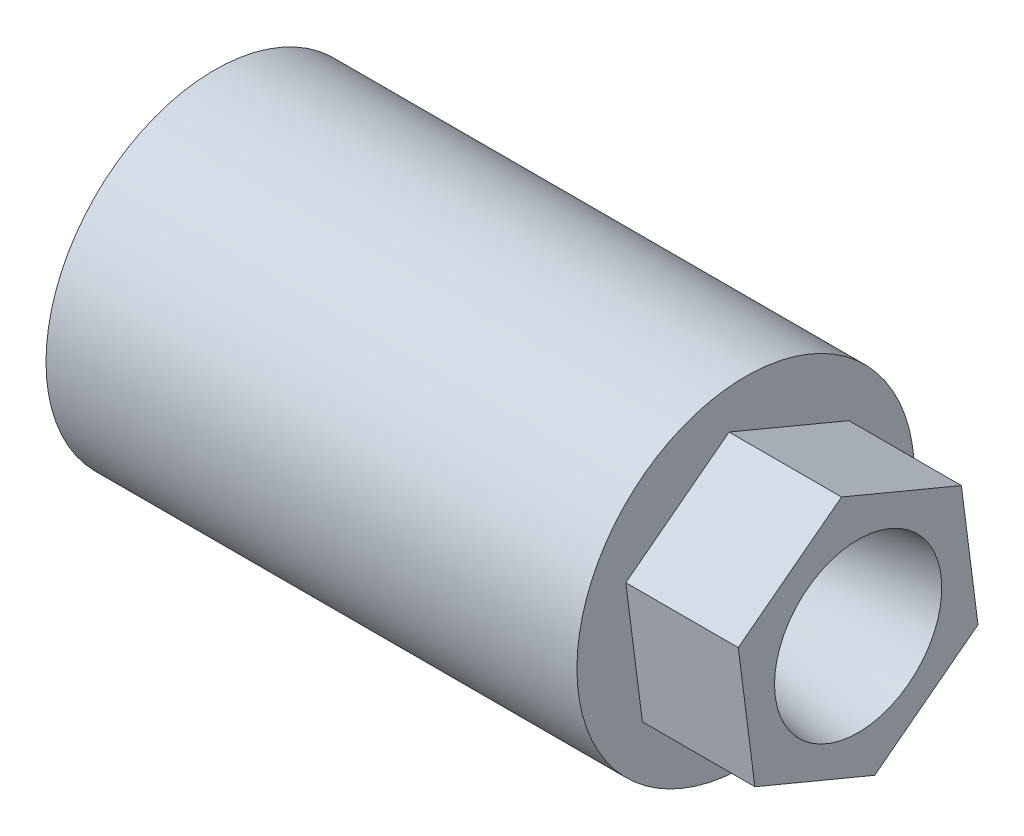
ISO-10303-21;
HEADER;
FILE_DESCRIPTION(('STEP AP214'),'2;1');
FILE_NAME('part.step','',(''),(''),'','','');
FILE_SCHEMA(('AUTOMOTIVE_DESIGN { 1 0 10303 214 1 1 1 1 }'));
ENDSEC;
DATA;
#1=APPLICATION_CONTEXT('core data for automotive mechanical design processes');
#2=APPLICATION_PROTOCOL_DEFINITION('international standard','automotive_design',2000,#1);
#3=PRODUCT_CONTEXT('',#1,'mechanical');
#4=PRODUCT('Part','Part','',(#3));
#5=PRODUCT_RELATED_PRODUCT_CATEGORY('part','',(#4));
#6=PRODUCT_DEFINITION_FORMATION('','',#4);
#7=PRODUCT_DEFINITION_CONTEXT('part definition',#1,'design');
#8=PRODUCT_DEFINITION('design','',#6,#7);
#9=PRODUCT_DEFINITION_SHAPE('','',#8);
#10=(LENGTH_UNIT() NAMED_UNIT(*) SI_UNIT(.MILLI.,.METRE.));
#11=(NAMED_UNIT(*) PLANE_ANGLE_UNIT() SI_UNIT($,.RADIAN.));
#12=(NAMED_UNIT(*) SI_UNIT($,.STERADIAN.) SOLID_ANGLE_UNIT());
#13=UNCERTAINTY_MEASURE_WITH_UNIT(LENGTH_MEASURE(1.E-05),#10,'distance_accuracy_value','');
#14=(GEOMETRIC_REPRESENTATION_CONTEXT(3) GLOBAL_UNCERTAINTY_ASSIGNED_CONTEXT((#13)) GLOBAL_UNIT_ASSIGNED_CONTEXT((#10,
#11,#12)) REPRESENTATION_CONTEXT('',''));
#15=CARTESIAN_POINT('',(0.,0.,0.));
#16=DIRECTION('',(0.,0.,1.));
#17=DIRECTION('',(1.,0.,0.));
#18=AXIS2_PLACEMENT_3D('',#15,#16,#17);
#19=CARTESIAN_POINT('',(10.9227966832155,9.525,0.));
#20=DIRECTION('',(-1.,0.,0.));
#21=DIRECTION('',(0.,0.,1.));
#22=AXIS2_PLACEMENT_3D('',#19,#20,#21);
#23=PLANE('',#22);
#24=CARTESIAN_POINT('',(10.9227966832155,0.,0.));
#25=DIRECTION('',(-1.,0.,0.));
#26=DIRECTION('',(0.,0.,1.));
#27=AXIS2_PLACEMENT_3D('',#24,#25,#26);
#28=CIRCLE('',#27,4.72194129569608);
#29=CARTESIAN_POINT('',(10.9227966832155,0.,4.72194129569608));
#30=VERTEX_POINT('',#29);
#31=EDGE_CURVE('E183',#30,#30,#28,.T.);
#32=ORIENTED_EDGE('',*,*,#31,.T.);
#33=EDGE_LOOP('',(#32));
#34=FACE_BOUND('',#33,.T.);
#35=DIRECTION('',(0.,-0.385175832029674,-0.922843203594331));
#36=VECTOR('',#35,1.);
#37=CARTESIAN_POINT('',(10.9227966832155,-5.860054342824,2.44586653338843));
#38=LINE('',#37,#36);
#39=CARTESIAN_POINT('',(10.9227966832155,-4.44793264137029,5.82917048568371));
#40=VERTEX_POINT('',#39);
#41=CARTESIAN_POINT('',(10.9227966832155,-7.27217604427771,-0.937437418906843));
#42=VERTEX_POINT('',#41);
#43=EDGE_CURVE('E50',#40,#42,#38,.T.);
#44=ORIENTED_EDGE('',*,*,#43,.T.);
#45=DIRECTION('',(0.,0.606617742007669,-0.794993657258671));
#46=VECTOR('',#45,1.);
#47=CARTESIAN_POINT('',(10.9227966832155,-5.04820972359256,-3.85202266174869));
#48=LINE('',#47,#46);
#49=CARTESIAN_POINT('',(10.9227966832155,-2.82424340290741,-6.76660790459055));
#50=VERTEX_POINT('',#49);
#51=EDGE_CURVE('E82',#42,#50,#48,.T.);
#52=ORIENTED_EDGE('',*,*,#51,.T.);
#53=DIRECTION('',(0.,0.991793574037343,0.12784954633566));
#54=VECTOR('',#53,1.);
#55=CARTESIAN_POINT('',(10.9227966832155,0.811844619231441,-6.29788919513713));
#56=LINE('',#55,#54);
#57=CARTESIAN_POINT('',(10.9227966832155,4.4479326413703,-5.8291704856837));
#58=VERTEX_POINT('',#57);
#59=EDGE_CURVE('E137',#50,#58,#56,.T.);
#60=ORIENTED_EDGE('',*,*,#59,.T.);
#61=DIRECTION('',(0.,0.385175832029674,0.922843203594331));
#62=VECTOR('',#61,1.);
#63=CARTESIAN_POINT('',(10.9227966832155,5.860054342824,-2.44586653338843));
#64=LINE('',#63,#62);
#65=CARTESIAN_POINT('',(10.9227966832155,7.27217604427771,0.937437418906843));
#66=VERTEX_POINT('',#65);
#67=EDGE_CURVE('E112',#58,#66,#64,.T.);
#68=ORIENTED_EDGE('',*,*,#67,.T.);
#69=DIRECTION('',(0.,-0.606617742007669,0.794993657258671));
#70=VECTOR('',#69,1.);
#71=CARTESIAN_POINT('',(10.9227966832155,5.04820972359256,3.85202266174869));
#72=LINE('',#71,#70);
#73=CARTESIAN_POINT('',(10.9227966832155,2.82424340290741,6.76660790459055));
#74=VERTEX_POINT('',#73);
#75=EDGE_CURVE('E133',#66,#74,#72,.T.);
#76=ORIENTED_EDGE('',*,*,#75,.T.);
#77=DIRECTION('',(0.,-0.991793574037343,-0.12784954633566));
#78=VECTOR('',#77,1.);
#79=CARTESIAN_POINT('',(10.9227966832155,-0.81184461923144,6.29788919513713));
#80=LINE('',#79,#78);
#81=EDGE_CURVE('E130',#74,#40,#80,.T.);
#82=ORIENTED_EDGE('',*,*,#81,.T.);
#83=EDGE_LOOP('',(#44,#52,#60,#68,#76,#82));
#84=FACE_BOUND('',#83,.T.);
#85=ADVANCED_FACE('F35',(#34,#84),#23,.F.);
#86=CARTESIAN_POINT('',(0.,0.,0.));
#87=DIRECTION('',(-1.,0.,0.));
#88=DIRECTION('',(0.,0.,1.));
#89=AXIS2_PLACEMENT_3D('',#86,#87,#88);
#90=CYLINDRICAL_SURFACE('',#89,9.525);
#91=CARTESIAN_POINT('',(-25.4,0.,0.));
#92=DIRECTION('',(-1.,0.,0.));
#93=DIRECTION('',(0.,0.,1.));
#94=AXIS2_PLACEMENT_3D('',#91,#92,#93);
#95=CIRCLE('',#94,9.525);
#96=CARTESIAN_POINT('',(-25.4,0.,9.525));
#97=VERTEX_POINT('',#96);
#98=EDGE_CURVE('E230',#97,#97,#95,.T.);
#99=ORIENTED_EDGE('',*,*,#98,.F.);
#100=EDGE_LOOP('',(#99));
#101=FACE_BOUND('',#100,.T.);
#102=CARTESIAN_POINT('',(4.57279668321551,0.,0.));
#103=DIRECTION('',(1.,0.,0.));
#104=DIRECTION('',(0.,0.,-1.));
#105=AXIS2_PLACEMENT_3D('',#102,#103,#104);
#106=CIRCLE('',#105,9.525);
#107=CARTESIAN_POINT('',(4.57279668321551,0.,-9.525));
#108=VERTEX_POINT('',#107);
#109=EDGE_CURVE('E125',#108,#108,#106,.T.);
#110=ORIENTED_EDGE('',*,*,#109,.F.);
#111=EDGE_LOOP('',(#110));
#112=FACE_BOUND('',#111,.T.);
#113=ADVANCED_FACE('F170',(#101,#112),#90,.T.);
#114=CARTESIAN_POINT('',(0.,0.,0.));
#115=DIRECTION('',(-1.,0.,0.));
#116=DIRECTION('',(0.,0.,1.));
#117=AXIS2_PLACEMENT_3D('',#114,#115,#116);
#118=TOROIDAL_SURFACE('',#117,5.08,3.048);
#119=CARTESIAN_POINT('',(0.,0.,0.));
#120=DIRECTION('',(-1.,0.,0.));
#121=DIRECTION('',(0.,0.,1.));
#122=AXIS2_PLACEMENT_3D('',#119,#120,#121);
#123=CIRCLE('',#122,2.032);
#124=CARTESIAN_POINT('',(0.,0.,2.032));
#125=VERTEX_POINT('',#124);
#126=EDGE_CURVE('E11',#125,#125,#123,.T.);
#127=ORIENTED_EDGE('',*,*,#126,.F.);
#128=EDGE_LOOP('',(#127));
#129=FACE_BOUND('',#128,.T.);
#130=CARTESIAN_POINT('',(-2.1552614690566,0.,0.));
#131=DIRECTION('',(-1.,0.,0.));
#132=DIRECTION('',(0.,0.,1.));
#133=AXIS2_PLACEMENT_3D('',#130,#131,#132);
#134=CIRCLE('',#133,2.92473853094341);
#135=CARTESIAN_POINT('',(-2.1552614690566,0.,2.92473853094341));
#136=VERTEX_POINT('',#135);
#137=EDGE_CURVE('E143',#136,#136,#134,.T.);
#138=ORIENTED_EDGE('',*,*,#137,.T.);
#139=EDGE_LOOP('',(#138));
#140=FACE_BOUND('',#139,.T.);
#141=ADVANCED_FACE('F37',(#129,#140),#118,.T.);
#142=CARTESIAN_POINT('',(0.,0.,0.));
#143=DIRECTION('',(-1.,0.,0.));
#144=DIRECTION('',(0.,0.,1.));
#145=AXIS2_PLACEMENT_3D('',#142,#143,#144);
#146=TOROIDAL_SURFACE('',#145,2.8448,0.8128);
#147=CARTESIAN_POINT('',(0.277993972559898,0.,0.));
#148=DIRECTION('',(-1.,0.,0.));
#149=DIRECTION('',(0.,0.,1.));
#150=AXIS2_PLACEMENT_3D('',#147,#148,#149);
#151=CIRCLE('',#150,2.08101783775305);
#152=CARTESIAN_POINT('',(0.277993972559898,0.,2.08101783775305));
#153=VERTEX_POINT('',#152);
#154=EDGE_CURVE('E43',#153,#153,#151,.T.);
#155=ORIENTED_EDGE('',*,*,#154,.F.);
#156=EDGE_LOOP('',(#155));
#157=FACE_BOUND('',#156,.T.);
#158=ORIENTED_EDGE('',*,*,#126,.T.);
#159=EDGE_LOOP('',(#158));
#160=FACE_BOUND('',#159,.T.);
#161=ADVANCED_FACE('F162',(#157,#160),#146,.T.);
#162=CARTESIAN_POINT('',(332501.272288594,-943155.226670919,0.));
#163=CARTESIAN_POINT('',(-342019.865331947,939694.701803655,0.));
#164=CARTESIAN_POINT('',(351539.57035119,-936225.85286504,0.));
#165=B_SPLINE_CURVE_WITH_KNOTS('',2,(#162,#163,#164),.UNSPECIFIED.,.F.,.F.,(3,3),(0.,1.),.UNSPECIFIED.);
#166=CARTESIAN_POINT('',(0.,0.,0.));
#167=DIRECTION('',(-1.,0.,0.));
#168=AXIS1_PLACEMENT('',#166,#167);
#169=SURFACE_OF_REVOLUTION('',#165,#168);
#170=ORIENTED_EDGE('',*,*,#31,.F.);
#171=EDGE_LOOP('',(#170));
#172=FACE_BOUND('',#171,.T.);
#173=ORIENTED_EDGE('',*,*,#154,.T.);
#174=EDGE_LOOP('',(#173));
#175=FACE_BOUND('',#174,.T.);
#176=ADVANCED_FACE('F158',(#172,#175),#169,.T.);
#177=CARTESIAN_POINT('',(-25.4,5.74736391748426,0.));
#178=DIRECTION('',(1.,0.,0.));
#179=DIRECTION('',(0.,0.,-1.));
#180=AXIS2_PLACEMENT_3D('',#177,#178,#179);
#181=PLANE('',#180);
#182=CARTESIAN_POINT('',(-25.4,0.,0.));
#183=DIRECTION('',(-1.,0.,0.));
#184=DIRECTION('',(0.,0.,1.));
#185=AXIS2_PLACEMENT_3D('',#182,#183,#184);
#186=CIRCLE('',#185,5.74736391748426);
#187=CARTESIAN_POINT('',(-25.4,0.,5.74736391748426));
#188=VERTEX_POINT('',#187);
#189=EDGE_CURVE('E227',#188,#188,#186,.T.);
#190=ORIENTED_EDGE('',*,*,#189,.F.);
#191=EDGE_LOOP('',(#190));
#192=FACE_BOUND('',#191,.T.);
#193=ORIENTED_EDGE('',*,*,#98,.T.);
#194=EDGE_LOOP('',(#193));
#195=FACE_BOUND('',#194,.T.);
#196=ADVANCED_FACE('F161',(#192,#195),#181,.F.);
#197=CARTESIAN_POINT('',(0.,0.,0.));
#198=DIRECTION('',(-1.,0.,0.));
#199=DIRECTION('',(0.,0.,1.));
#200=AXIS2_PLACEMENT_3D('',#197,#198,#199);
#201=CYLINDRICAL_SURFACE('',#200,5.74736391748426);
#202=CARTESIAN_POINT('',(-6.29301491613203,0.,0.));
#203=DIRECTION('',(-1.,0.,0.));
#204=DIRECTION('',(0.,0.,1.));
#205=AXIS2_PLACEMENT_3D('',#202,#203,#204);
#206=CIRCLE('',#205,5.74736391748426);
#207=CARTESIAN_POINT('',(-6.29301491613203,0.,5.74736391748426));
#208=VERTEX_POINT('',#207);
#209=EDGE_CURVE('E233',#208,#208,#206,.T.);
#210=ORIENTED_EDGE('',*,*,#209,.F.);
#211=EDGE_LOOP('',(#210));
#212=FACE_BOUND('',#211,.T.);
#213=ORIENTED_EDGE('',*,*,#189,.T.);
#214=EDGE_LOOP('',(#213));
#215=FACE_BOUND('',#214,.T.);
#216=ADVANCED_FACE('F215',(#212,#215),#201,.F.);
#217=CARTESIAN_POINT('',(-6.29301491613202,0.,0.));
#218=DIRECTION('',(-1.,0.,0.));
#219=DIRECTION('',(0.,0.,1.));
#220=AXIS2_PLACEMENT_3D('',#217,#218,#219);
#221=DEGENERATE_TOROIDAL_SURFACE('',#220,2.57236391748426,3.175,.T.);
#222=CARTESIAN_POINT('',(-4.04795088586473,0.,0.));
#223=DIRECTION('',(-1.,0.,0.));
#224=DIRECTION('',(0.,0.,1.));
#225=AXIS2_PLACEMENT_3D('',#222,#223,#224);
#226=CIRCLE('',#225,4.81742794775155);
#227=CARTESIAN_POINT('',(-4.04795088586473,0.,4.81742794775155));
#228=VERTEX_POINT('',#227);
#229=EDGE_CURVE('E239',#228,#228,#226,.T.);
#230=ORIENTED_EDGE('',*,*,#229,.F.);
#231=EDGE_LOOP('',(#230));
#232=FACE_BOUND('',#231,.T.);
#233=ORIENTED_EDGE('',*,*,#209,.T.);
#234=EDGE_LOOP('',(#233));
#235=FACE_BOUND('',#234,.T.);
#236=ADVANCED_FACE('F211',(#232,#235),#221,.F.);
#237=CARTESIAN_POINT('',(-4.04795088586473,0.,0.));
#238=DIRECTION('',(-1.,0.,0.));
#239=DIRECTION('',(0.,0.,1.));
#240=AXIS2_PLACEMENT_3D('',#237,#238,#239);
#241=CONICAL_SURFACE('',#240,4.81742794775155,0.785398163397449);
#242=ORIENTED_EDGE('',*,*,#137,.F.);
#243=EDGE_LOOP('',(#242));
#244=FACE_BOUND('',#243,.T.);
#245=ORIENTED_EDGE('',*,*,#229,.T.);
#246=EDGE_LOOP('',(#245));
#247=FACE_BOUND('',#246,.T.);
#248=ADVANCED_FACE('F197',(#244,#247),#241,.F.);
#249=CARTESIAN_POINT('',(4.57279668321551,-5.860054342824,2.44586653338843));
#250=DIRECTION('',(0.,-0.922843203594331,0.385175832029674));
#251=DIRECTION('',(0.,-0.385175832029674,-0.922843203594331));
#252=AXIS2_PLACEMENT_3D('',#249,#250,#251);
#253=PLANE('',#252);
#254=ORIENTED_EDGE('',*,*,#43,.F.);
#255=DIRECTION('',(1.,0.,0.));
#256=VECTOR('',#255,1.);
#257=CARTESIAN_POINT('',(4.57279668321551,-4.44793264137029,5.82917048568371));
#258=LINE('',#257,#256);
#259=CARTESIAN_POINT('',(4.57279668321551,-4.44793264137029,5.82917048568371));
#260=VERTEX_POINT('',#259);
#261=EDGE_CURVE('E128',#260,#40,#258,.T.);
#262=ORIENTED_EDGE('',*,*,#261,.F.);
#263=DIRECTION('',(0.,-0.385175832029674,-0.922843203594331));
#264=VECTOR('',#263,1.);
#265=CARTESIAN_POINT('',(4.57279668321551,-5.860054342824,2.44586653338843));
#266=LINE('',#265,#264);
#267=CARTESIAN_POINT('',(4.57279668321551,-7.27217604427771,-0.937437418906843));
#268=VERTEX_POINT('',#267);
#269=EDGE_CURVE('E140',#260,#268,#266,.T.);
#270=ORIENTED_EDGE('',*,*,#269,.T.);
#271=DIRECTION('',(1.,0.,0.));
#272=VECTOR('',#271,1.);
#273=CARTESIAN_POINT('',(4.57279668321551,-7.27217604427771,-0.937437418906843));
#274=LINE('',#273,#272);
#275=EDGE_CURVE('E141',#268,#42,#274,.T.);
#276=ORIENTED_EDGE('',*,*,#275,.T.);
#277=EDGE_LOOP('',(#254,#262,#270,#276));
#278=FACE_BOUND('',#277,.T.);
#279=ADVANCED_FACE('F187',(#278),#253,.T.);
#280=CARTESIAN_POINT('',(4.57279668321551,-5.04820972359256,-3.85202266174869));
#281=DIRECTION('',(0.,-0.794993657258671,-0.606617742007669));
#282=DIRECTION('',(0.,0.606617742007669,-0.794993657258671));
#283=AXIS2_PLACEMENT_3D('',#280,#281,#282);
#284=PLANE('',#283);
#285=ORIENTED_EDGE('',*,*,#51,.F.);
#286=ORIENTED_EDGE('',*,*,#275,.F.);
#287=DIRECTION('',(0.,0.606617742007669,-0.794993657258671));
#288=VECTOR('',#287,1.);
#289=CARTESIAN_POINT('',(4.57279668321551,-5.04820972359256,-3.85202266174869));
#290=LINE('',#289,#288);
#291=CARTESIAN_POINT('',(4.57279668321551,-2.82424340290741,-6.76660790459055));
#292=VERTEX_POINT('',#291);
#293=EDGE_CURVE('E59',#268,#292,#290,.T.);
#294=ORIENTED_EDGE('',*,*,#293,.T.);
#295=DIRECTION('',(1.,0.,0.));
#296=VECTOR('',#295,1.);
#297=CARTESIAN_POINT('',(4.57279668321551,-2.82424340290741,-6.76660790459055));
#298=LINE('',#297,#296);
#299=EDGE_CURVE('E104',#292,#50,#298,.T.);
#300=ORIENTED_EDGE('',*,*,#299,.T.);
#301=EDGE_LOOP('',(#285,#286,#294,#300));
#302=FACE_BOUND('',#301,.T.);
#303=ADVANCED_FACE('F189',(#302),#284,.T.);
#304=CARTESIAN_POINT('',(4.57279668321551,0.811844619231441,-6.29788919513713));
#305=DIRECTION('',(0.,0.12784954633566,-0.991793574037343));
#306=DIRECTION('',(0.,0.991793574037343,0.12784954633566));
#307=AXIS2_PLACEMENT_3D('',#304,#305,#306);
#308=PLANE('',#307);
#309=ORIENTED_EDGE('',*,*,#59,.F.);
#310=ORIENTED_EDGE('',*,*,#299,.F.);
#311=DIRECTION('',(0.,0.991793574037343,0.12784954633566));
#312=VECTOR('',#311,1.);
#313=CARTESIAN_POINT('',(4.57279668321551,0.811844619231441,-6.29788919513713));
#314=LINE('',#313,#312);
#315=CARTESIAN_POINT('',(4.57279668321551,4.4479326413703,-5.8291704856837));
#316=VERTEX_POINT('',#315);
#317=EDGE_CURVE('E98',#292,#316,#314,.T.);
#318=ORIENTED_EDGE('',*,*,#317,.T.);
#319=DIRECTION('',(1.,0.,0.));
#320=VECTOR('',#319,1.);
#321=CARTESIAN_POINT('',(4.57279668321551,4.4479326413703,-5.8291704856837));
#322=LINE('',#321,#320);
#323=EDGE_CURVE('E102',#316,#58,#322,.T.);
#324=ORIENTED_EDGE('',*,*,#323,.T.);
#325=EDGE_LOOP('',(#309,#310,#318,#324));
#326=FACE_BOUND('',#325,.T.);
#327=ADVANCED_FACE('F101',(#326),#308,.T.);
#328=CARTESIAN_POINT('',(4.57279668321551,5.860054342824,-2.44586653338843));
#329=DIRECTION('',(0.,0.922843203594331,-0.385175832029674));
#330=DIRECTION('',(0.,0.385175832029674,0.922843203594331));
#331=AXIS2_PLACEMENT_3D('',#328,#329,#330);
#332=PLANE('',#331);
#333=ORIENTED_EDGE('',*,*,#67,.F.);
#334=ORIENTED_EDGE('',*,*,#323,.F.);
#335=DIRECTION('',(0.,0.385175832029674,0.922843203594331));
#336=VECTOR('',#335,1.);
#337=CARTESIAN_POINT('',(4.57279668321551,5.860054342824,-2.44586653338843));
#338=LINE('',#337,#336);
#339=CARTESIAN_POINT('',(4.57279668321551,7.27217604427771,0.937437418906843));
#340=VERTEX_POINT('',#339);
#341=EDGE_CURVE('E106',#316,#340,#338,.T.);
#342=ORIENTED_EDGE('',*,*,#341,.T.);
#343=DIRECTION('',(1.,0.,0.));
#344=VECTOR('',#343,1.);
#345=CARTESIAN_POINT('',(4.57279668321551,7.27217604427771,0.937437418906843));
#346=LINE('',#345,#344);
#347=EDGE_CURVE('E114',#340,#66,#346,.T.);
#348=ORIENTED_EDGE('',*,*,#347,.T.);
#349=EDGE_LOOP('',(#333,#334,#342,#348));
#350=FACE_BOUND('',#349,.T.);
#351=ADVANCED_FACE('F109',(#350),#332,.T.);
#352=CARTESIAN_POINT('',(4.57279668321551,5.04820972359256,3.85202266174869));
#353=DIRECTION('',(0.,0.794993657258671,0.606617742007669));
#354=DIRECTION('',(0.,-0.606617742007669,0.794993657258671));
#355=AXIS2_PLACEMENT_3D('',#352,#353,#354);
#356=PLANE('',#355);
#357=ORIENTED_EDGE('',*,*,#75,.F.);
#358=ORIENTED_EDGE('',*,*,#347,.F.);
#359=DIRECTION('',(0.,-0.606617742007669,0.794993657258671));
#360=VECTOR('',#359,1.);
#361=CARTESIAN_POINT('',(4.57279668321551,5.04820972359256,3.85202266174869));
#362=LINE('',#361,#360);
#363=CARTESIAN_POINT('',(4.57279668321551,2.82424340290741,6.76660790459055));
#364=VERTEX_POINT('',#363);
#365=EDGE_CURVE('E119',#340,#364,#362,.T.);
#366=ORIENTED_EDGE('',*,*,#365,.T.);
#367=DIRECTION('',(1.,0.,0.));
#368=VECTOR('',#367,1.);
#369=CARTESIAN_POINT('',(4.57279668321551,2.82424340290741,6.76660790459055));
#370=LINE('',#369,#368);
#371=EDGE_CURVE('E146',#364,#74,#370,.T.);
#372=ORIENTED_EDGE('',*,*,#371,.T.);
#373=EDGE_LOOP('',(#357,#358,#366,#372));
#374=FACE_BOUND('',#373,.T.);
#375=ADVANCED_FACE('F203',(#374),#356,.T.);
#376=CARTESIAN_POINT('',(4.57279668321551,-0.81184461923144,6.29788919513713));
#377=DIRECTION('',(0.,-0.12784954633566,0.991793574037343));
#378=DIRECTION('',(0.,-0.991793574037343,-0.12784954633566));
#379=AXIS2_PLACEMENT_3D('',#376,#377,#378);
#380=PLANE('',#379);
#381=ORIENTED_EDGE('',*,*,#81,.F.);
#382=ORIENTED_EDGE('',*,*,#371,.F.);
#383=DIRECTION('',(0.,-0.991793574037343,-0.12784954633566));
#384=VECTOR('',#383,1.);
#385=CARTESIAN_POINT('',(4.57279668321551,-0.81184461923144,6.29788919513713));
#386=LINE('',#385,#384);
#387=EDGE_CURVE('E89',#364,#260,#386,.T.);
#388=ORIENTED_EDGE('',*,*,#387,.T.);
#389=ORIENTED_EDGE('',*,*,#261,.T.);
#390=EDGE_LOOP('',(#381,#382,#388,#389));
#391=FACE_BOUND('',#390,.T.);
#392=ADVANCED_FACE('F186',(#391),#380,.T.);
#393=CARTESIAN_POINT('',(4.57279668321551,0.,0.));
#394=DIRECTION('',(1.,0.,0.));
#395=DIRECTION('',(0.,0.,-1.));
#396=AXIS2_PLACEMENT_3D('',#393,#394,#395);
#397=PLANE('',#396);
#398=ORIENTED_EDGE('',*,*,#269,.F.);
#399=ORIENTED_EDGE('',*,*,#387,.F.);
#400=ORIENTED_EDGE('',*,*,#365,.F.);
#401=ORIENTED_EDGE('',*,*,#341,.F.);
#402=ORIENTED_EDGE('',*,*,#317,.F.);
#403=ORIENTED_EDGE('',*,*,#293,.F.);
#404=EDGE_LOOP('',(#398,#399,#400,#401,#402,#403));
#405=FACE_BOUND('',#404,.T.);
#406=ORIENTED_EDGE('',*,*,#109,.T.);
#407=EDGE_LOOP('',(#406));
#408=FACE_BOUND('',#407,.T.);
#409=ADVANCED_FACE('F117',(#405,#408),#397,.T.);
#410=CLOSED_SHELL('',(#85,#113,#141,#161,#176,#196,#216,#236,#248,#279,#303,#327,#351,#375,#392,#409));
#411=MANIFOLD_SOLID_BREP('B2',#410);
#412=ADVANCED_BREP_SHAPE_REPRESENTATION('',(#18,#411),#14);
#413=SHAPE_DEFINITION_REPRESENTATION(#9,#412);
ENDSEC;
END-ISO-10303-21;
